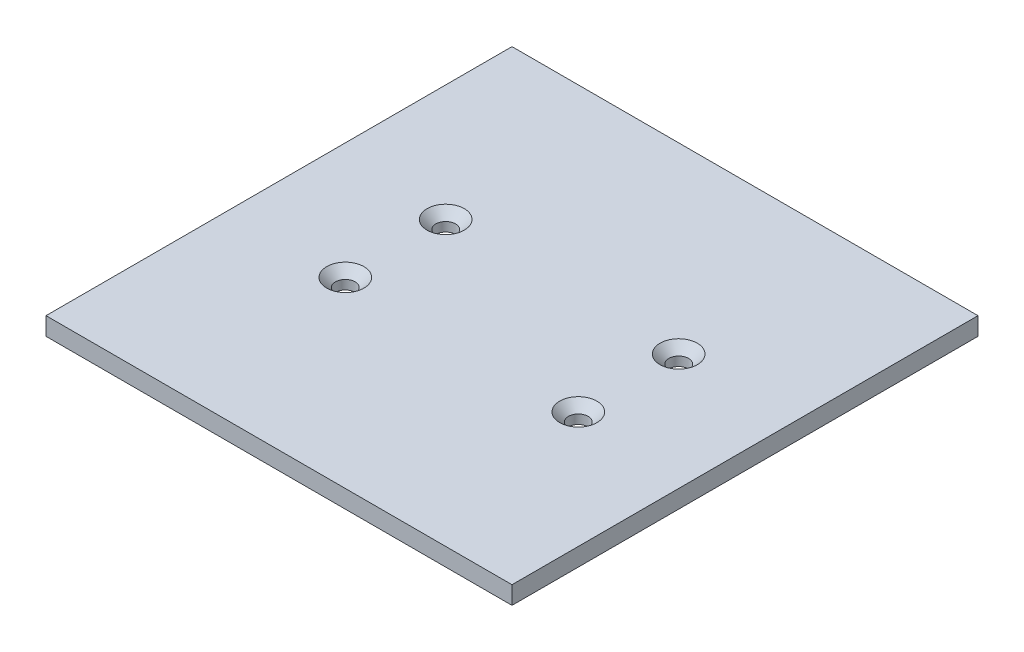
ISO-10303-21;
HEADER;
FILE_DESCRIPTION(('STEP AP214'),'2;1');
FILE_NAME('part.step','',(''),(''),'','','');
FILE_SCHEMA(('AUTOMOTIVE_DESIGN { 1 0 10303 214 1 1 1 1 }'));
ENDSEC;
DATA;
#1=APPLICATION_CONTEXT('core data for automotive mechanical design processes');
#2=APPLICATION_PROTOCOL_DEFINITION('international standard','automotive_design',2000,#1);
#3=PRODUCT_CONTEXT('',#1,'mechanical');
#4=PRODUCT('Part','Part','',(#3));
#5=PRODUCT_RELATED_PRODUCT_CATEGORY('part','',(#4));
#6=PRODUCT_DEFINITION_FORMATION('','',#4);
#7=PRODUCT_DEFINITION_CONTEXT('part definition',#1,'design');
#8=PRODUCT_DEFINITION('design','',#6,#7);
#9=PRODUCT_DEFINITION_SHAPE('','',#8);
#10=(LENGTH_UNIT() NAMED_UNIT(*) SI_UNIT(.MILLI.,.METRE.));
#11=(NAMED_UNIT(*) PLANE_ANGLE_UNIT() SI_UNIT($,.RADIAN.));
#12=(NAMED_UNIT(*) SI_UNIT($,.STERADIAN.) SOLID_ANGLE_UNIT());
#13=UNCERTAINTY_MEASURE_WITH_UNIT(LENGTH_MEASURE(1.E-05),#10,'distance_accuracy_value','');
#14=(GEOMETRIC_REPRESENTATION_CONTEXT(3) GLOBAL_UNCERTAINTY_ASSIGNED_CONTEXT((#13)) GLOBAL_UNIT_ASSIGNED_CONTEXT((#10,
#11,#12)) REPRESENTATION_CONTEXT('',''));
#15=CARTESIAN_POINT('',(0.,0.,0.));
#16=DIRECTION('',(0.,0.,1.));
#17=DIRECTION('',(1.,0.,0.));
#18=AXIS2_PLACEMENT_3D('',#15,#16,#17);
#19=CARTESIAN_POINT('',(-65.,5.,-65.));
#20=DIRECTION('',(1.,0.,0.));
#21=DIRECTION('',(0.,0.,-1.));
#22=AXIS2_PLACEMENT_3D('',#19,#20,#21);
#23=PLANE('',#22);
#24=DIRECTION('',(0.,0.,1.));
#25=VECTOR('',#24,1.);
#26=CARTESIAN_POINT('',(-65.,0.,-65.));
#27=LINE('',#26,#25);
#28=CARTESIAN_POINT('',(-65.,0.,-65.));
#29=VERTEX_POINT('',#28);
#30=CARTESIAN_POINT('',(-65.,0.,65.));
#31=VERTEX_POINT('',#30);
#32=EDGE_CURVE('E97',#29,#31,#27,.T.);
#33=ORIENTED_EDGE('',*,*,#32,.T.);
#34=DIRECTION('',(0.,-1.,0.));
#35=VECTOR('',#34,1.);
#36=CARTESIAN_POINT('',(-65.,5.,65.));
#37=LINE('',#36,#35);
#38=CARTESIAN_POINT('',(-65.,5.,65.));
#39=VERTEX_POINT('',#38);
#40=EDGE_CURVE('E11',#39,#31,#37,.T.);
#41=ORIENTED_EDGE('',*,*,#40,.F.);
#42=DIRECTION('',(0.,0.,1.));
#43=VECTOR('',#42,1.);
#44=CARTESIAN_POINT('',(-65.,5.,-65.));
#45=LINE('',#44,#43);
#46=CARTESIAN_POINT('',(-65.,5.,-65.));
#47=VERTEX_POINT('',#46);
#48=EDGE_CURVE('E85',#47,#39,#45,.T.);
#49=ORIENTED_EDGE('',*,*,#48,.F.);
#50=DIRECTION('',(0.,-1.,0.));
#51=VECTOR('',#50,1.);
#52=CARTESIAN_POINT('',(-65.,5.,-65.));
#53=LINE('',#52,#51);
#54=EDGE_CURVE('E93',#47,#29,#53,.T.);
#55=ORIENTED_EDGE('',*,*,#54,.T.);
#56=EDGE_LOOP('',(#33,#41,#49,#55));
#57=FACE_BOUND('',#56,.T.);
#58=ADVANCED_FACE('F34',(#57),#23,.F.);
#59=CARTESIAN_POINT('',(-65.,5.,65.));
#60=DIRECTION('',(0.,0.,-1.));
#61=DIRECTION('',(-1.,0.,0.));
#62=AXIS2_PLACEMENT_3D('',#59,#60,#61);
#63=PLANE('',#62);
#64=DIRECTION('',(1.,0.,0.));
#65=VECTOR('',#64,1.);
#66=CARTESIAN_POINT('',(-65.,0.,65.));
#67=LINE('',#66,#65);
#68=CARTESIAN_POINT('',(65.,0.,65.));
#69=VERTEX_POINT('',#68);
#70=EDGE_CURVE('E89',#31,#69,#67,.T.);
#71=ORIENTED_EDGE('',*,*,#70,.T.);
#72=DIRECTION('',(0.,-1.,0.));
#73=VECTOR('',#72,1.);
#74=CARTESIAN_POINT('',(65.,5.,65.));
#75=LINE('',#74,#73);
#76=CARTESIAN_POINT('',(65.,5.,65.));
#77=VERTEX_POINT('',#76);
#78=EDGE_CURVE('E42',#77,#69,#75,.T.);
#79=ORIENTED_EDGE('',*,*,#78,.F.);
#80=DIRECTION('',(1.,0.,0.));
#81=VECTOR('',#80,1.);
#82=CARTESIAN_POINT('',(-65.,5.,65.));
#83=LINE('',#82,#81);
#84=EDGE_CURVE('E80',#39,#77,#83,.T.);
#85=ORIENTED_EDGE('',*,*,#84,.F.);
#86=ORIENTED_EDGE('',*,*,#40,.T.);
#87=EDGE_LOOP('',(#71,#79,#85,#86));
#88=FACE_BOUND('',#87,.T.);
#89=ADVANCED_FACE('F88',(#88),#63,.F.);
#90=CARTESIAN_POINT('',(65.,5.,-65.));
#91=DIRECTION('',(-1.,0.,0.));
#92=DIRECTION('',(0.,0.,1.));
#93=AXIS2_PLACEMENT_3D('',#90,#91,#92);
#94=PLANE('',#93);
#95=DIRECTION('',(0.,0.,-1.));
#96=VECTOR('',#95,1.);
#97=CARTESIAN_POINT('',(65.,0.,-65.));
#98=LINE('',#97,#96);
#99=CARTESIAN_POINT('',(65.,0.,-65.));
#100=VERTEX_POINT('',#99);
#101=EDGE_CURVE('E67',#69,#100,#98,.T.);
#102=ORIENTED_EDGE('',*,*,#101,.T.);
#103=DIRECTION('',(0.,-1.,0.));
#104=VECTOR('',#103,1.);
#105=CARTESIAN_POINT('',(65.,5.,-65.));
#106=LINE('',#105,#104);
#107=CARTESIAN_POINT('',(65.,5.,-65.));
#108=VERTEX_POINT('',#107);
#109=EDGE_CURVE('E90',#108,#100,#106,.T.);
#110=ORIENTED_EDGE('',*,*,#109,.F.);
#111=DIRECTION('',(0.,0.,-1.));
#112=VECTOR('',#111,1.);
#113=CARTESIAN_POINT('',(65.,5.,-65.));
#114=LINE('',#113,#112);
#115=EDGE_CURVE('E83',#77,#108,#114,.T.);
#116=ORIENTED_EDGE('',*,*,#115,.F.);
#117=ORIENTED_EDGE('',*,*,#78,.T.);
#118=EDGE_LOOP('',(#102,#110,#116,#117));
#119=FACE_BOUND('',#118,.T.);
#120=ADVANCED_FACE('F91',(#119),#94,.F.);
#121=CARTESIAN_POINT('',(-65.,5.,-65.));
#122=DIRECTION('',(0.,0.,1.));
#123=DIRECTION('',(1.,0.,0.));
#124=AXIS2_PLACEMENT_3D('',#121,#122,#123);
#125=PLANE('',#124);
#126=DIRECTION('',(-1.,0.,0.));
#127=VECTOR('',#126,1.);
#128=CARTESIAN_POINT('',(-65.,0.,-65.));
#129=LINE('',#128,#127);
#130=EDGE_CURVE('E73',#100,#29,#129,.T.);
#131=ORIENTED_EDGE('',*,*,#130,.T.);
#132=ORIENTED_EDGE('',*,*,#54,.F.);
#133=DIRECTION('',(-1.,0.,0.));
#134=VECTOR('',#133,1.);
#135=CARTESIAN_POINT('',(-65.,5.,-65.));
#136=LINE('',#135,#134);
#137=EDGE_CURVE('E50',#108,#47,#136,.T.);
#138=ORIENTED_EDGE('',*,*,#137,.F.);
#139=ORIENTED_EDGE('',*,*,#109,.T.);
#140=EDGE_LOOP('',(#131,#132,#138,#139));
#141=FACE_BOUND('',#140,.T.);
#142=ADVANCED_FACE('F105',(#141),#125,.F.);
#143=CARTESIAN_POINT('',(0.,5.,0.));
#144=DIRECTION('',(0.,1.,0.));
#145=DIRECTION('',(0.,0.,1.));
#146=AXIS2_PLACEMENT_3D('',#143,#144,#145);
#147=PLANE('',#146);
#148=CARTESIAN_POINT('',(-32.5,5.,-14.));
#149=DIRECTION('',(0.,1.,0.));
#150=DIRECTION('',(0.,0.,1.));
#151=AXIS2_PLACEMENT_3D('',#148,#149,#150);
#152=CIRCLE('',#151,5.2);
#153=CARTESIAN_POINT('',(-32.5,5.,-8.8));
#154=VERTEX_POINT('',#153);
#155=EDGE_CURVE('E143',#154,#154,#152,.T.);
#156=ORIENTED_EDGE('',*,*,#155,.F.);
#157=EDGE_LOOP('',(#156));
#158=FACE_BOUND('',#157,.T.);
#159=CARTESIAN_POINT('',(32.5,5.,-14.));
#160=DIRECTION('',(0.,1.,0.));
#161=DIRECTION('',(0.,0.,1.));
#162=AXIS2_PLACEMENT_3D('',#159,#160,#161);
#163=CIRCLE('',#162,5.2);
#164=CARTESIAN_POINT('',(32.5,5.,-8.8));
#165=VERTEX_POINT('',#164);
#166=EDGE_CURVE('E134',#165,#165,#163,.T.);
#167=ORIENTED_EDGE('',*,*,#166,.F.);
#168=EDGE_LOOP('',(#167));
#169=FACE_BOUND('',#168,.T.);
#170=CARTESIAN_POINT('',(32.5,5.,14.));
#171=DIRECTION('',(0.,1.,0.));
#172=DIRECTION('',(0.,0.,1.));
#173=AXIS2_PLACEMENT_3D('',#170,#171,#172);
#174=CIRCLE('',#173,5.2);
#175=CARTESIAN_POINT('',(32.5,5.,19.2));
#176=VERTEX_POINT('',#175);
#177=EDGE_CURVE('E125',#176,#176,#174,.T.);
#178=ORIENTED_EDGE('',*,*,#177,.F.);
#179=EDGE_LOOP('',(#178));
#180=FACE_BOUND('',#179,.T.);
#181=CARTESIAN_POINT('',(-32.5,5.,14.));
#182=DIRECTION('',(0.,1.,0.));
#183=DIRECTION('',(0.,0.,1.));
#184=AXIS2_PLACEMENT_3D('',#181,#182,#183);
#185=CIRCLE('',#184,5.2);
#186=CARTESIAN_POINT('',(-32.5,5.,19.2));
#187=VERTEX_POINT('',#186);
#188=EDGE_CURVE('E116',#187,#187,#185,.T.);
#189=ORIENTED_EDGE('',*,*,#188,.F.);
#190=EDGE_LOOP('',(#189));
#191=FACE_BOUND('',#190,.T.);
#192=ORIENTED_EDGE('',*,*,#48,.T.);
#193=ORIENTED_EDGE('',*,*,#84,.T.);
#194=ORIENTED_EDGE('',*,*,#115,.T.);
#195=ORIENTED_EDGE('',*,*,#137,.T.);
#196=EDGE_LOOP('',(#192,#193,#194,#195));
#197=FACE_BOUND('',#196,.T.);
#198=ADVANCED_FACE('F81',(#158,#169,#180,#191,#197),#147,.T.);
#199=CARTESIAN_POINT('',(0.,0.,0.));
#200=DIRECTION('',(0.,1.,0.));
#201=DIRECTION('',(0.,0.,1.));
#202=AXIS2_PLACEMENT_3D('',#199,#200,#201);
#203=PLANE('',#202);
#204=CARTESIAN_POINT('',(-32.5,0.,-14.));
#205=DIRECTION('',(0.,1.,0.));
#206=DIRECTION('',(0.,0.,1.));
#207=AXIS2_PLACEMENT_3D('',#204,#205,#206);
#208=CIRCLE('',#207,2.75);
#209=CARTESIAN_POINT('',(-32.5,0.,-11.25));
#210=VERTEX_POINT('',#209);
#211=EDGE_CURVE('E137',#210,#210,#208,.T.);
#212=ORIENTED_EDGE('',*,*,#211,.T.);
#213=EDGE_LOOP('',(#212));
#214=FACE_BOUND('',#213,.T.);
#215=CARTESIAN_POINT('',(32.5,0.,-14.));
#216=DIRECTION('',(0.,1.,0.));
#217=DIRECTION('',(0.,0.,1.));
#218=AXIS2_PLACEMENT_3D('',#215,#216,#217);
#219=CIRCLE('',#218,2.75);
#220=CARTESIAN_POINT('',(32.5,0.,-11.25));
#221=VERTEX_POINT('',#220);
#222=EDGE_CURVE('E128',#221,#221,#219,.T.);
#223=ORIENTED_EDGE('',*,*,#222,.T.);
#224=EDGE_LOOP('',(#223));
#225=FACE_BOUND('',#224,.T.);
#226=CARTESIAN_POINT('',(32.5,0.,14.));
#227=DIRECTION('',(0.,1.,0.));
#228=DIRECTION('',(0.,0.,1.));
#229=AXIS2_PLACEMENT_3D('',#226,#227,#228);
#230=CIRCLE('',#229,2.75);
#231=CARTESIAN_POINT('',(32.5,0.,16.75));
#232=VERTEX_POINT('',#231);
#233=EDGE_CURVE('E119',#232,#232,#230,.T.);
#234=ORIENTED_EDGE('',*,*,#233,.T.);
#235=EDGE_LOOP('',(#234));
#236=FACE_BOUND('',#235,.T.);
#237=CARTESIAN_POINT('',(-32.5,0.,14.));
#238=DIRECTION('',(0.,1.,0.));
#239=DIRECTION('',(0.,0.,1.));
#240=AXIS2_PLACEMENT_3D('',#237,#238,#239);
#241=CIRCLE('',#240,2.75);
#242=CARTESIAN_POINT('',(-32.5,0.,16.75));
#243=VERTEX_POINT('',#242);
#244=EDGE_CURVE('E100',#243,#243,#241,.T.);
#245=ORIENTED_EDGE('',*,*,#244,.T.);
#246=EDGE_LOOP('',(#245));
#247=FACE_BOUND('',#246,.T.);
#248=ORIENTED_EDGE('',*,*,#32,.F.);
#249=ORIENTED_EDGE('',*,*,#130,.F.);
#250=ORIENTED_EDGE('',*,*,#101,.F.);
#251=ORIENTED_EDGE('',*,*,#70,.F.);
#252=EDGE_LOOP('',(#248,#249,#250,#251));
#253=FACE_BOUND('',#252,.T.);
#254=ADVANCED_FACE('F108',(#214,#225,#236,#247,#253),#203,.F.);
#255=CARTESIAN_POINT('',(-32.5,5.,14.));
#256=DIRECTION('',(0.,1.,0.));
#257=DIRECTION('',(0.,0.,1.));
#258=AXIS2_PLACEMENT_3D('',#255,#256,#257);
#259=CYLINDRICAL_SURFACE('',#258,2.75);
#260=ORIENTED_EDGE('',*,*,#244,.F.);
#261=EDGE_LOOP('',(#260));
#262=FACE_BOUND('',#261,.T.);
#263=CARTESIAN_POINT('',(-32.5,2.55,14.));
#264=DIRECTION('',(0.,1.,0.));
#265=DIRECTION('',(0.,0.,1.));
#266=AXIS2_PLACEMENT_3D('',#263,#264,#265);
#267=CIRCLE('',#266,2.75);
#268=CARTESIAN_POINT('',(-32.5,2.55,16.75));
#269=VERTEX_POINT('',#268);
#270=EDGE_CURVE('E113',#269,#269,#267,.T.);
#271=ORIENTED_EDGE('',*,*,#270,.T.);
#272=EDGE_LOOP('',(#271));
#273=FACE_BOUND('',#272,.T.);
#274=ADVANCED_FACE('F161',(#262,#273),#259,.F.);
#275=CARTESIAN_POINT('',(-32.5,5.,14.));
#276=DIRECTION('',(0.,1.,0.));
#277=DIRECTION('',(0.,0.,1.));
#278=AXIS2_PLACEMENT_3D('',#275,#276,#277);
#279=CONICAL_SURFACE('',#278,5.2,0.785398163397448);
#280=ORIENTED_EDGE('',*,*,#270,.F.);
#281=EDGE_LOOP('',(#280));
#282=FACE_BOUND('',#281,.T.);
#283=ORIENTED_EDGE('',*,*,#188,.T.);
#284=EDGE_LOOP('',(#283));
#285=FACE_BOUND('',#284,.T.);
#286=ADVANCED_FACE('F158',(#282,#285),#279,.F.);
#287=CARTESIAN_POINT('',(32.5,5.,14.));
#288=DIRECTION('',(0.,1.,0.));
#289=DIRECTION('',(0.,0.,1.));
#290=AXIS2_PLACEMENT_3D('',#287,#288,#289);
#291=CYLINDRICAL_SURFACE('',#290,2.75);
#292=ORIENTED_EDGE('',*,*,#233,.F.);
#293=EDGE_LOOP('',(#292));
#294=FACE_BOUND('',#293,.T.);
#295=CARTESIAN_POINT('',(32.5,2.55,14.));
#296=DIRECTION('',(0.,1.,0.));
#297=DIRECTION('',(0.,0.,1.));
#298=AXIS2_PLACEMENT_3D('',#295,#296,#297);
#299=CIRCLE('',#298,2.75);
#300=CARTESIAN_POINT('',(32.5,2.55,16.75));
#301=VERTEX_POINT('',#300);
#302=EDGE_CURVE('E122',#301,#301,#299,.T.);
#303=ORIENTED_EDGE('',*,*,#302,.T.);
#304=EDGE_LOOP('',(#303));
#305=FACE_BOUND('',#304,.T.);
#306=ADVANCED_FACE('F160',(#294,#305),#291,.F.);
#307=CARTESIAN_POINT('',(32.5,5.,14.));
#308=DIRECTION('',(0.,1.,0.));
#309=DIRECTION('',(0.,0.,1.));
#310=AXIS2_PLACEMENT_3D('',#307,#308,#309);
#311=CONICAL_SURFACE('',#310,5.2,0.785398163397448);
#312=ORIENTED_EDGE('',*,*,#302,.F.);
#313=EDGE_LOOP('',(#312));
#314=FACE_BOUND('',#313,.T.);
#315=ORIENTED_EDGE('',*,*,#177,.T.);
#316=EDGE_LOOP('',(#315));
#317=FACE_BOUND('',#316,.T.);
#318=ADVANCED_FACE('F168',(#314,#317),#311,.F.);
#319=CARTESIAN_POINT('',(32.5,5.,-14.));
#320=DIRECTION('',(0.,1.,0.));
#321=DIRECTION('',(0.,0.,1.));
#322=AXIS2_PLACEMENT_3D('',#319,#320,#321);
#323=CYLINDRICAL_SURFACE('',#322,2.75);
#324=ORIENTED_EDGE('',*,*,#222,.F.);
#325=EDGE_LOOP('',(#324));
#326=FACE_BOUND('',#325,.T.);
#327=CARTESIAN_POINT('',(32.5,2.55,-14.));
#328=DIRECTION('',(0.,1.,0.));
#329=DIRECTION('',(0.,0.,1.));
#330=AXIS2_PLACEMENT_3D('',#327,#328,#329);
#331=CIRCLE('',#330,2.75);
#332=CARTESIAN_POINT('',(32.5,2.55,-11.25));
#333=VERTEX_POINT('',#332);
#334=EDGE_CURVE('E131',#333,#333,#331,.T.);
#335=ORIENTED_EDGE('',*,*,#334,.T.);
#336=EDGE_LOOP('',(#335));
#337=FACE_BOUND('',#336,.T.);
#338=ADVANCED_FACE('F202',(#326,#337),#323,.F.);
#339=CARTESIAN_POINT('',(32.5,5.,-14.));
#340=DIRECTION('',(0.,1.,0.));
#341=DIRECTION('',(0.,0.,1.));
#342=AXIS2_PLACEMENT_3D('',#339,#340,#341);
#343=CONICAL_SURFACE('',#342,5.2,0.785398163397448);
#344=ORIENTED_EDGE('',*,*,#334,.F.);
#345=EDGE_LOOP('',(#344));
#346=FACE_BOUND('',#345,.T.);
#347=ORIENTED_EDGE('',*,*,#166,.T.);
#348=EDGE_LOOP('',(#347));
#349=FACE_BOUND('',#348,.T.);
#350=ADVANCED_FACE('F207',(#346,#349),#343,.F.);
#351=CARTESIAN_POINT('',(-32.5,5.,-14.));
#352=DIRECTION('',(0.,1.,0.));
#353=DIRECTION('',(0.,0.,1.));
#354=AXIS2_PLACEMENT_3D('',#351,#352,#353);
#355=CYLINDRICAL_SURFACE('',#354,2.75);
#356=ORIENTED_EDGE('',*,*,#211,.F.);
#357=EDGE_LOOP('',(#356));
#358=FACE_BOUND('',#357,.T.);
#359=CARTESIAN_POINT('',(-32.5,2.55,-14.));
#360=DIRECTION('',(0.,1.,0.));
#361=DIRECTION('',(0.,0.,1.));
#362=AXIS2_PLACEMENT_3D('',#359,#360,#361);
#363=CIRCLE('',#362,2.75);
#364=CARTESIAN_POINT('',(-32.5,2.55,-11.25));
#365=VERTEX_POINT('',#364);
#366=EDGE_CURVE('E140',#365,#365,#363,.T.);
#367=ORIENTED_EDGE('',*,*,#366,.T.);
#368=EDGE_LOOP('',(#367));
#369=FACE_BOUND('',#368,.T.);
#370=ADVANCED_FACE('F213',(#358,#369),#355,.F.);
#371=CARTESIAN_POINT('',(-32.5,5.,-14.));
#372=DIRECTION('',(0.,1.,0.));
#373=DIRECTION('',(0.,0.,1.));
#374=AXIS2_PLACEMENT_3D('',#371,#372,#373);
#375=CONICAL_SURFACE('',#374,5.2,0.785398163397448);
#376=ORIENTED_EDGE('',*,*,#366,.F.);
#377=EDGE_LOOP('',(#376));
#378=FACE_BOUND('',#377,.T.);
#379=ORIENTED_EDGE('',*,*,#155,.T.);
#380=EDGE_LOOP('',(#379));
#381=FACE_BOUND('',#380,.T.);
#382=ADVANCED_FACE('F147',(#378,#381),#375,.F.);
#383=CLOSED_SHELL('',(#58,#89,#120,#142,#198,#254,#274,#286,#306,#318,#338,#350,#370,#382));
#384=MANIFOLD_SOLID_BREP('B2',#383);
#385=ADVANCED_BREP_SHAPE_REPRESENTATION('',(#18,#384),#14);
#386=SHAPE_DEFINITION_REPRESENTATION(#9,#385);
ENDSEC;
END-ISO-10303-21;
